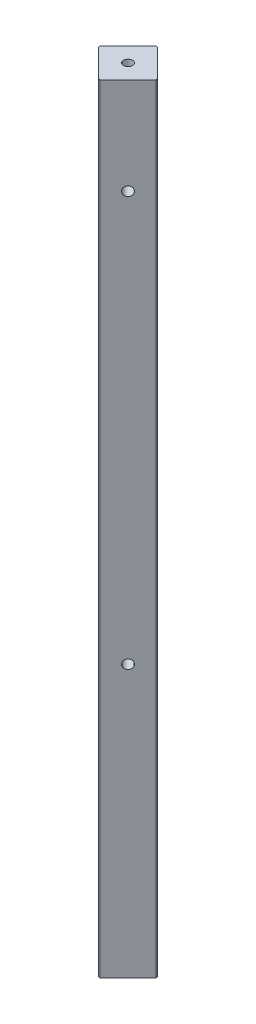
ISO-10303-21;
HEADER;
FILE_DESCRIPTION(('STEP AP214'),'2;1');
FILE_NAME('part.step','',(''),(''),'','','');
FILE_SCHEMA(('AUTOMOTIVE_DESIGN { 1 0 10303 214 1 1 1 1 }'));
ENDSEC;
DATA;
#1=APPLICATION_CONTEXT('core data for automotive mechanical design processes');
#2=APPLICATION_PROTOCOL_DEFINITION('international standard','automotive_design',2000,#1);
#3=PRODUCT_CONTEXT('',#1,'mechanical');
#4=PRODUCT('Part','Part','',(#3));
#5=PRODUCT_RELATED_PRODUCT_CATEGORY('part','',(#4));
#6=PRODUCT_DEFINITION_FORMATION('','',#4);
#7=PRODUCT_DEFINITION_CONTEXT('part definition',#1,'design');
#8=PRODUCT_DEFINITION('design','',#6,#7);
#9=PRODUCT_DEFINITION_SHAPE('','',#8);
#10=(LENGTH_UNIT() NAMED_UNIT(*) SI_UNIT(.MILLI.,.METRE.));
#11=(NAMED_UNIT(*) PLANE_ANGLE_UNIT() SI_UNIT($,.RADIAN.));
#12=(NAMED_UNIT(*) SI_UNIT($,.STERADIAN.) SOLID_ANGLE_UNIT());
#13=UNCERTAINTY_MEASURE_WITH_UNIT(LENGTH_MEASURE(1.E-05),#10,'distance_accuracy_value','');
#14=(GEOMETRIC_REPRESENTATION_CONTEXT(3) GLOBAL_UNCERTAINTY_ASSIGNED_CONTEXT((#13)) GLOBAL_UNIT_ASSIGNED_CONTEXT((#10,
#11,#12)) REPRESENTATION_CONTEXT('',''));
#15=CARTESIAN_POINT('',(0.,0.,0.));
#16=DIRECTION('',(0.,0.,1.));
#17=DIRECTION('',(1.,0.,0.));
#18=AXIS2_PLACEMENT_3D('',#15,#16,#17);
#19=CARTESIAN_POINT('',(9.89949493661166,0.,0.));
#20=DIRECTION('',(0.,-1.,0.));
#21=DIRECTION('',(0.,0.,-1.));
#22=AXIS2_PLACEMENT_3D('',#19,#20,#21);
#23=PLANE('',#22);
#24=CARTESIAN_POINT('',(0.,0.,0.));
#25=DIRECTION('',(0.,-1.,0.));
#26=DIRECTION('',(0.,0.,-1.));
#27=AXIS2_PLACEMENT_3D('',#24,#25,#26);
#28=CIRCLE('',#27,1.64999999999999);
#29=CARTESIAN_POINT('',(0.,0.,-1.64999999999999));
#30=VERTEX_POINT('',#29);
#31=EDGE_CURVE('E116',#30,#30,#28,.T.);
#32=ORIENTED_EDGE('',*,*,#31,.F.);
#33=EDGE_LOOP('',(#32));
#34=FACE_BOUND('',#33,.T.);
#35=CARTESIAN_POINT('',(9.89949493661166,0.,0.));
#36=DIRECTION('',(0.,1.,0.));
#37=DIRECTION('',(0.,0.,-1.));
#38=AXIS2_PLACEMENT_3D('',#35,#36,#37);
#39=CIRCLE('',#38,0.500000000000001);
#40=CARTESIAN_POINT('',(10.2530483272049,0.,0.353553390593277));
#41=VERTEX_POINT('',#40);
#42=CARTESIAN_POINT('',(10.2530483272049,0.,-0.353553390593272));
#43=VERTEX_POINT('',#42);
#44=EDGE_CURVE('E128',#41,#43,#39,.T.);
#45=ORIENTED_EDGE('',*,*,#44,.F.);
#46=DIRECTION('',(0.707106781186548,0.,-0.707106781186547));
#47=VECTOR('',#46,1.);
#48=CARTESIAN_POINT('',(10.2530483272049,0.,0.353553390593277));
#49=LINE('',#48,#47);
#50=CARTESIAN_POINT('',(0.353553390593274,0.,10.2530483272049));
#51=VERTEX_POINT('',#50);
#52=EDGE_CURVE('E164',#51,#41,#49,.T.);
#53=ORIENTED_EDGE('',*,*,#52,.F.);
#54=CARTESIAN_POINT('',(0.,0.,9.89949493661167));
#55=DIRECTION('',(0.,1.,0.));
#56=DIRECTION('',(0.,0.,1.));
#57=AXIS2_PLACEMENT_3D('',#54,#55,#56);
#58=CIRCLE('',#57,0.5);
#59=CARTESIAN_POINT('',(-0.353553390593274,0.,10.2530483272049));
#60=VERTEX_POINT('',#59);
#61=EDGE_CURVE('E161',#60,#51,#58,.T.);
#62=ORIENTED_EDGE('',*,*,#61,.F.);
#63=DIRECTION('',(0.707106781186548,0.,0.707106781186547));
#64=VECTOR('',#63,1.);
#65=CARTESIAN_POINT('',(-10.2530483272049,0.,0.353553390593276));
#66=LINE('',#65,#64);
#67=CARTESIAN_POINT('',(-10.2530483272049,0.,0.353553390593277));
#68=VERTEX_POINT('',#67);
#69=EDGE_CURVE('E158',#68,#60,#66,.T.);
#70=ORIENTED_EDGE('',*,*,#69,.F.);
#71=CARTESIAN_POINT('',(-9.89949493661167,0.,0.));
#72=DIRECTION('',(0.,1.,0.));
#73=DIRECTION('',(0.,0.,1.));
#74=AXIS2_PLACEMENT_3D('',#71,#72,#73);
#75=CIRCLE('',#74,0.500000000000002);
#76=CARTESIAN_POINT('',(-10.2530483272049,0.,-0.353553390593274));
#77=VERTEX_POINT('',#76);
#78=EDGE_CURVE('E155',#77,#68,#75,.T.);
#79=ORIENTED_EDGE('',*,*,#78,.F.);
#80=DIRECTION('',(-0.707106781186548,0.,0.707106781186547));
#81=VECTOR('',#80,1.);
#82=CARTESIAN_POINT('',(-0.353553390593273,0.,-10.2530483272049));
#83=LINE('',#82,#81);
#84=CARTESIAN_POINT('',(-0.353553390593273,0.,-10.2530483272049));
#85=VERTEX_POINT('',#84);
#86=EDGE_CURVE('E152',#85,#77,#83,.T.);
#87=ORIENTED_EDGE('',*,*,#86,.F.);
#88=CARTESIAN_POINT('',(0.,0.,-9.89949493661167));
#89=DIRECTION('',(0.,1.,0.));
#90=DIRECTION('',(0.,0.,1.));
#91=AXIS2_PLACEMENT_3D('',#88,#89,#90);
#92=CIRCLE('',#91,0.5);
#93=CARTESIAN_POINT('',(0.353553390593274,0.,-10.2530483272049));
#94=VERTEX_POINT('',#93);
#95=EDGE_CURVE('E149',#94,#85,#92,.T.);
#96=ORIENTED_EDGE('',*,*,#95,.F.);
#97=DIRECTION('',(-0.707106781186547,0.,-0.707106781186548));
#98=VECTOR('',#97,1.);
#99=CARTESIAN_POINT('',(0.353553390593274,0.,-10.2530483272049));
#100=LINE('',#99,#98);
#101=EDGE_CURVE('E146',#43,#94,#100,.T.);
#102=ORIENTED_EDGE('',*,*,#101,.F.);
#103=EDGE_LOOP('',(#45,#53,#62,#70,#79,#87,#96,#102));
#104=FACE_BOUND('',#103,.T.);
#105=ADVANCED_FACE('F37',(#34,#104),#23,.T.);
#106=CARTESIAN_POINT('',(10.2530483272049,311.414213562373,0.353553390593277));
#107=DIRECTION('',(-0.707106781186547,0.,-0.707106781186548));
#108=DIRECTION('',(-0.707106781186548,0.,0.707106781186547));
#109=AXIS2_PLACEMENT_3D('',#106,#107,#108);
#110=PLANE('',#109);
#111=CARTESIAN_POINT('',(5.30330085890624,98.4999999999996,5.30330085889197));
#112=DIRECTION('',(-0.707106781186547,0.,-0.707106781186548));
#113=DIRECTION('',(-0.707106781186548,0.,0.707106781186547));
#114=AXIS2_PLACEMENT_3D('',#111,#112,#113);
#115=CIRCLE('',#114,1.64999999999999);
#116=CARTESIAN_POINT('',(4.13657466994844,98.4999999999996,6.47002704784977));
#117=VERTEX_POINT('',#116);
#118=EDGE_CURVE('E272',#117,#117,#115,.T.);
#119=ORIENTED_EDGE('',*,*,#118,.T.);
#120=EDGE_LOOP('',(#119));
#121=FACE_BOUND('',#120,.T.);
#122=CARTESIAN_POINT('',(5.30330085890627,247.,5.30330085889194));
#123=DIRECTION('',(-0.707106781186547,0.,-0.707106781186548));
#124=DIRECTION('',(-0.707106781186548,0.,0.707106781186547));
#125=AXIS2_PLACEMENT_3D('',#122,#123,#124);
#126=CIRCLE('',#125,1.64999999999998);
#127=CARTESIAN_POINT('',(4.13657466994848,247.,6.47002704784973));
#128=VERTEX_POINT('',#127);
#129=EDGE_CURVE('E266',#128,#128,#126,.T.);
#130=ORIENTED_EDGE('',*,*,#129,.T.);
#131=EDGE_LOOP('',(#130));
#132=FACE_BOUND('',#131,.T.);
#133=DIRECTION('',(0.,-1.,0.));
#134=VECTOR('',#133,1.);
#135=CARTESIAN_POINT('',(10.2530483272049,311.414213562373,0.353553390593277));
#136=LINE('',#135,#134);
#137=CARTESIAN_POINT('',(10.2530483272049,282.,0.353553390593277));
#138=VERTEX_POINT('',#137);
#139=EDGE_CURVE('E167',#138,#41,#136,.T.);
#140=ORIENTED_EDGE('',*,*,#139,.F.);
#141=DIRECTION('',(-0.707106781186548,0.,0.707106781186547));
#142=VECTOR('',#141,1.);
#143=CARTESIAN_POINT('',(10.2530483272049,282.,0.353553390593277));
#144=LINE('',#143,#142);
#145=CARTESIAN_POINT('',(0.353553390593274,282.,10.2530483272049));
#146=VERTEX_POINT('',#145);
#147=EDGE_CURVE('E133',#138,#146,#144,.T.);
#148=ORIENTED_EDGE('',*,*,#147,.T.);
#149=DIRECTION('',(0.,-1.,0.));
#150=VECTOR('',#149,1.);
#151=CARTESIAN_POINT('',(0.353553390593274,311.414213562373,10.2530483272049));
#152=LINE('',#151,#150);
#153=EDGE_CURVE('E169',#146,#51,#152,.T.);
#154=ORIENTED_EDGE('',*,*,#153,.T.);
#155=ORIENTED_EDGE('',*,*,#52,.T.);
#156=EDGE_LOOP('',(#140,#148,#154,#155));
#157=FACE_BOUND('',#156,.T.);
#158=ADVANCED_FACE('F185',(#121,#132,#157),#110,.F.);
#159=CARTESIAN_POINT('',(0.,311.414213562373,9.89949493661167));
#160=DIRECTION('',(0.,-1.,0.));
#161=DIRECTION('',(0.,0.,-1.));
#162=AXIS2_PLACEMENT_3D('',#159,#160,#161);
#163=CYLINDRICAL_SURFACE('',#162,0.5);
#164=ORIENTED_EDGE('',*,*,#153,.F.);
#165=CARTESIAN_POINT('',(0.,282.,9.89949493661167));
#166=DIRECTION('',(0.,-1.,0.));
#167=DIRECTION('',(0.,0.,-1.));
#168=AXIS2_PLACEMENT_3D('',#165,#166,#167);
#169=CIRCLE('',#168,0.5);
#170=CARTESIAN_POINT('',(-0.353553390593274,282.,10.2530483272049));
#171=VERTEX_POINT('',#170);
#172=EDGE_CURVE('E129',#146,#171,#169,.T.);
#173=ORIENTED_EDGE('',*,*,#172,.T.);
#174=DIRECTION('',(0.,-1.,0.));
#175=VECTOR('',#174,1.);
#176=CARTESIAN_POINT('',(-0.353553390593274,311.414213562373,10.2530483272049));
#177=LINE('',#176,#175);
#178=EDGE_CURVE('E171',#171,#60,#177,.T.);
#179=ORIENTED_EDGE('',*,*,#178,.T.);
#180=ORIENTED_EDGE('',*,*,#61,.T.);
#181=EDGE_LOOP('',(#164,#173,#179,#180));
#182=FACE_BOUND('',#181,.T.);
#183=ADVANCED_FACE('F211',(#182),#163,.T.);
#184=CARTESIAN_POINT('',(-10.2530483272049,311.414213562373,0.353553390593276));
#185=DIRECTION('',(0.707106781186547,0.,-0.707106781186548));
#186=DIRECTION('',(-0.707106781186548,0.,-0.707106781186547));
#187=AXIS2_PLACEMENT_3D('',#184,#185,#186);
#188=PLANE('',#187);
#189=CARTESIAN_POINT('',(-5.30330085889892,268.599999999996,5.3033008588993));
#190=DIRECTION('',(0.707106781186547,0.,-0.707106781186548));
#191=DIRECTION('',(-0.707106781186548,0.,-0.707106781186547));
#192=AXIS2_PLACEMENT_3D('',#189,#190,#191);
#193=CIRCLE('',#192,1.64999999999998);
#194=CARTESIAN_POINT('',(-6.47002704785671,268.599999999996,4.13657466994151));
#195=VERTEX_POINT('',#194);
#196=EDGE_CURVE('E282',#195,#195,#193,.T.);
#197=ORIENTED_EDGE('',*,*,#196,.T.);
#198=EDGE_LOOP('',(#197));
#199=FACE_BOUND('',#198,.T.);
#200=CARTESIAN_POINT('',(-5.30330085889681,252.599999999996,5.3033008589014));
#201=DIRECTION('',(0.707106781186547,0.,-0.707106781186548));
#202=DIRECTION('',(-0.707106781186548,0.,-0.707106781186547));
#203=AXIS2_PLACEMENT_3D('',#200,#201,#202);
#204=CIRCLE('',#203,1.64999999999998);
#205=CARTESIAN_POINT('',(-6.4700270478546,252.599999999996,4.13657466994361));
#206=VERTEX_POINT('',#205);
#207=EDGE_CURVE('E278',#206,#206,#204,.T.);
#208=ORIENTED_EDGE('',*,*,#207,.T.);
#209=EDGE_LOOP('',(#208));
#210=FACE_BOUND('',#209,.T.);
#211=CARTESIAN_POINT('',(-5.30330085889901,90.9999999999999,5.30330085889921));
#212=DIRECTION('',(-0.707106781186547,0.,0.707106781186548));
#213=DIRECTION('',(0.707106781186548,0.,0.707106781186547));
#214=AXIS2_PLACEMENT_3D('',#211,#212,#213);
#215=CIRCLE('',#214,1.64999999999998);
#216=CARTESIAN_POINT('',(-4.13657466994122,90.9999999999999,6.470027047857));
#217=VERTEX_POINT('',#216);
#218=EDGE_CURVE('E261',#217,#217,#215,.T.);
#219=ORIENTED_EDGE('',*,*,#218,.F.);
#220=EDGE_LOOP('',(#219));
#221=FACE_BOUND('',#220,.T.);
#222=CARTESIAN_POINT('',(-5.303300858899,32.0000000000002,5.30330085889921));
#223=DIRECTION('',(-0.707106781186547,0.,0.707106781186548));
#224=DIRECTION('',(0.707106781186548,0.,0.707106781186547));
#225=AXIS2_PLACEMENT_3D('',#222,#223,#224);
#226=CIRCLE('',#225,1.64999999999998);
#227=CARTESIAN_POINT('',(-4.13657466994121,32.0000000000002,6.470027047857));
#228=VERTEX_POINT('',#227);
#229=EDGE_CURVE('E257',#228,#228,#226,.T.);
#230=ORIENTED_EDGE('',*,*,#229,.F.);
#231=EDGE_LOOP('',(#230));
#232=FACE_BOUND('',#231,.T.);
#233=ORIENTED_EDGE('',*,*,#178,.F.);
#234=DIRECTION('',(-0.707106781186548,0.,-0.707106781186547));
#235=VECTOR('',#234,1.);
#236=CARTESIAN_POINT('',(-10.2530483272049,282.,0.353553390593276));
#237=LINE('',#236,#235);
#238=CARTESIAN_POINT('',(-10.2530483272049,282.,0.353553390593277));
#239=VERTEX_POINT('',#238);
#240=EDGE_CURVE('E132',#171,#239,#237,.T.);
#241=ORIENTED_EDGE('',*,*,#240,.T.);
#242=DIRECTION('',(0.,-1.,0.));
#243=VECTOR('',#242,1.);
#244=CARTESIAN_POINT('',(-10.2530483272049,311.414213562373,0.353553390593277));
#245=LINE('',#244,#243);
#246=EDGE_CURVE('E173',#239,#68,#245,.T.);
#247=ORIENTED_EDGE('',*,*,#246,.T.);
#248=ORIENTED_EDGE('',*,*,#69,.T.);
#249=EDGE_LOOP('',(#233,#241,#247,#248));
#250=FACE_BOUND('',#249,.T.);
#251=ADVANCED_FACE('F208',(#199,#210,#221,#232,#250),#188,.F.);
#252=CARTESIAN_POINT('',(-9.89949493661167,311.414213562373,0.));
#253=DIRECTION('',(0.,-1.,0.));
#254=DIRECTION('',(0.,0.,-1.));
#255=AXIS2_PLACEMENT_3D('',#252,#253,#254);
#256=CYLINDRICAL_SURFACE('',#255,0.500000000000002);
#257=ORIENTED_EDGE('',*,*,#246,.F.);
#258=CARTESIAN_POINT('',(-9.89949493661167,282.,0.));
#259=DIRECTION('',(0.,-1.,0.));
#260=DIRECTION('',(0.,0.,-1.));
#261=AXIS2_PLACEMENT_3D('',#258,#259,#260);
#262=CIRCLE('',#261,0.500000000000002);
#263=CARTESIAN_POINT('',(-10.2530483272049,282.,-0.353553390593273));
#264=VERTEX_POINT('',#263);
#265=EDGE_CURVE('E136',#239,#264,#262,.T.);
#266=ORIENTED_EDGE('',*,*,#265,.T.);
#267=DIRECTION('',(0.,-1.,0.));
#268=VECTOR('',#267,1.);
#269=CARTESIAN_POINT('',(-10.2530483272049,311.414213562373,-0.353553390593274));
#270=LINE('',#269,#268);
#271=EDGE_CURVE('E175',#264,#77,#270,.T.);
#272=ORIENTED_EDGE('',*,*,#271,.T.);
#273=ORIENTED_EDGE('',*,*,#78,.T.);
#274=EDGE_LOOP('',(#257,#266,#272,#273));
#275=FACE_BOUND('',#274,.T.);
#276=ADVANCED_FACE('F204',(#275),#256,.T.);
#277=CARTESIAN_POINT('',(-0.353553390593273,311.414213562373,-10.2530483272049));
#278=DIRECTION('',(0.707106781186547,0.,0.707106781186548));
#279=DIRECTION('',(0.707106781186548,0.,-0.707106781186547));
#280=AXIS2_PLACEMENT_3D('',#277,#278,#279);
#281=PLANE('',#280);
#282=CARTESIAN_POINT('',(-5.30330085889197,98.4999999999996,-5.30330085890625));
#283=DIRECTION('',(-0.707106781186547,0.,-0.707106781186548));
#284=DIRECTION('',(-0.707106781186548,0.,0.707106781186547));
#285=AXIS2_PLACEMENT_3D('',#282,#283,#284);
#286=CIRCLE('',#285,1.64999999999998);
#287=CARTESIAN_POINT('',(-6.47002704784977,98.4999999999996,-4.13657466994845));
#288=VERTEX_POINT('',#287);
#289=EDGE_CURVE('E275',#288,#288,#286,.T.);
#290=ORIENTED_EDGE('',*,*,#289,.F.);
#291=EDGE_LOOP('',(#290));
#292=FACE_BOUND('',#291,.T.);
#293=CARTESIAN_POINT('',(-5.30330085889195,247.,-5.30330085890628));
#294=DIRECTION('',(-0.707106781186547,0.,-0.707106781186548));
#295=DIRECTION('',(-0.707106781186548,0.,0.707106781186547));
#296=AXIS2_PLACEMENT_3D('',#293,#294,#295);
#297=CIRCLE('',#296,1.64999999999998);
#298=CARTESIAN_POINT('',(-6.47002704784974,247.,-4.13657466994848));
#299=VERTEX_POINT('',#298);
#300=EDGE_CURVE('E269',#299,#299,#297,.T.);
#301=ORIENTED_EDGE('',*,*,#300,.F.);
#302=EDGE_LOOP('',(#301));
#303=FACE_BOUND('',#302,.T.);
#304=ORIENTED_EDGE('',*,*,#271,.F.);
#305=DIRECTION('',(0.707106781186548,0.,-0.707106781186547));
#306=VECTOR('',#305,1.);
#307=CARTESIAN_POINT('',(-0.353553390593273,282.,-10.2530483272049));
#308=LINE('',#307,#306);
#309=CARTESIAN_POINT('',(-0.353553390593273,282.,-10.2530483272049));
#310=VERTEX_POINT('',#309);
#311=EDGE_CURVE('E139',#264,#310,#308,.T.);
#312=ORIENTED_EDGE('',*,*,#311,.T.);
#313=DIRECTION('',(0.,-1.,0.));
#314=VECTOR('',#313,1.);
#315=CARTESIAN_POINT('',(-0.353553390593273,311.414213562373,-10.2530483272049));
#316=LINE('',#315,#314);
#317=EDGE_CURVE('E177',#310,#85,#316,.T.);
#318=ORIENTED_EDGE('',*,*,#317,.T.);
#319=ORIENTED_EDGE('',*,*,#86,.T.);
#320=EDGE_LOOP('',(#304,#312,#318,#319));
#321=FACE_BOUND('',#320,.T.);
#322=ADVANCED_FACE('F200',(#292,#303,#321),#281,.F.);
#323=CARTESIAN_POINT('',(0.,311.414213562373,-9.89949493661167));
#324=DIRECTION('',(0.,-1.,0.));
#325=DIRECTION('',(0.,0.,-1.));
#326=AXIS2_PLACEMENT_3D('',#323,#324,#325);
#327=CYLINDRICAL_SURFACE('',#326,0.5);
#328=ORIENTED_EDGE('',*,*,#317,.F.);
#329=CARTESIAN_POINT('',(0.,282.,-9.89949493661167));
#330=DIRECTION('',(0.,-1.,0.));
#331=DIRECTION('',(0.,0.,-1.));
#332=AXIS2_PLACEMENT_3D('',#329,#330,#331);
#333=CIRCLE('',#332,0.5);
#334=CARTESIAN_POINT('',(0.353553390593274,282.,-10.2530483272049));
#335=VERTEX_POINT('',#334);
#336=EDGE_CURVE('E58',#310,#335,#333,.T.);
#337=ORIENTED_EDGE('',*,*,#336,.T.);
#338=DIRECTION('',(0.,-1.,0.));
#339=VECTOR('',#338,1.);
#340=CARTESIAN_POINT('',(0.353553390593274,311.414213562373,-10.2530483272049));
#341=LINE('',#340,#339);
#342=EDGE_CURVE('E179',#335,#94,#341,.T.);
#343=ORIENTED_EDGE('',*,*,#342,.T.);
#344=ORIENTED_EDGE('',*,*,#95,.T.);
#345=EDGE_LOOP('',(#328,#337,#343,#344));
#346=FACE_BOUND('',#345,.T.);
#347=ADVANCED_FACE('F196',(#346),#327,.T.);
#348=CARTESIAN_POINT('',(0.353553390593274,311.414213562373,-10.2530483272049));
#349=DIRECTION('',(-0.707106781186548,0.,0.707106781186547));
#350=DIRECTION('',(0.707106781186547,0.,0.707106781186548));
#351=AXIS2_PLACEMENT_3D('',#348,#349,#350);
#352=PLANE('',#351);
#353=CARTESIAN_POINT('',(5.3033008588993,268.599999999996,-5.30330085889891));
#354=DIRECTION('',(0.707106781186548,0.,-0.707106781186547));
#355=DIRECTION('',(-0.707106781186547,0.,-0.707106781186548));
#356=AXIS2_PLACEMENT_3D('',#353,#354,#355);
#357=CIRCLE('',#356,1.64999999999998);
#358=CARTESIAN_POINT('',(4.13657466994151,268.599999999996,-6.47002704785671));
#359=VERTEX_POINT('',#358);
#360=EDGE_CURVE('E245',#359,#359,#357,.T.);
#361=ORIENTED_EDGE('',*,*,#360,.F.);
#362=EDGE_LOOP('',(#361));
#363=FACE_BOUND('',#362,.T.);
#364=CARTESIAN_POINT('',(5.3033008589014,252.599999999996,-5.30330085889681));
#365=DIRECTION('',(0.707106781186548,0.,-0.707106781186547));
#366=DIRECTION('',(-0.707106781186547,0.,-0.707106781186548));
#367=AXIS2_PLACEMENT_3D('',#364,#365,#366);
#368=CIRCLE('',#367,1.64999999999998);
#369=CARTESIAN_POINT('',(4.13657466994361,252.599999999996,-6.4700270478546));
#370=VERTEX_POINT('',#369);
#371=EDGE_CURVE('E249',#370,#370,#368,.T.);
#372=ORIENTED_EDGE('',*,*,#371,.F.);
#373=EDGE_LOOP('',(#372));
#374=FACE_BOUND('',#373,.T.);
#375=CARTESIAN_POINT('',(5.3033008588992,90.9999999999999,-5.30330085889901));
#376=DIRECTION('',(-0.707106781186548,0.,0.707106781186547));
#377=DIRECTION('',(0.707106781186547,0.,0.707106781186548));
#378=AXIS2_PLACEMENT_3D('',#375,#376,#377);
#379=CIRCLE('',#378,1.64999999999999);
#380=CARTESIAN_POINT('',(6.470027047857,90.9999999999999,-4.13657466994121));
#381=VERTEX_POINT('',#380);
#382=EDGE_CURVE('E253',#381,#381,#379,.T.);
#383=ORIENTED_EDGE('',*,*,#382,.T.);
#384=EDGE_LOOP('',(#383));
#385=FACE_BOUND('',#384,.T.);
#386=CARTESIAN_POINT('',(5.30330085889921,32.0000000000002,-5.303300858899));
#387=DIRECTION('',(-0.707106781186548,0.,0.707106781186547));
#388=DIRECTION('',(0.707106781186547,0.,0.707106781186548));
#389=AXIS2_PLACEMENT_3D('',#386,#387,#388);
#390=CIRCLE('',#389,1.64999999999999);
#391=CARTESIAN_POINT('',(6.470027047857,32.0000000000002,-4.13657466994121));
#392=VERTEX_POINT('',#391);
#393=EDGE_CURVE('E41',#392,#392,#390,.T.);
#394=ORIENTED_EDGE('',*,*,#393,.T.);
#395=EDGE_LOOP('',(#394));
#396=FACE_BOUND('',#395,.T.);
#397=ORIENTED_EDGE('',*,*,#342,.F.);
#398=DIRECTION('',(0.707106781186547,0.,0.707106781186548));
#399=VECTOR('',#398,1.);
#400=CARTESIAN_POINT('',(0.353553390593274,282.,-10.2530483272049));
#401=LINE('',#400,#399);
#402=CARTESIAN_POINT('',(10.2530483272049,282.,-0.353553390593273));
#403=VERTEX_POINT('',#402);
#404=EDGE_CURVE('E46',#335,#403,#401,.T.);
#405=ORIENTED_EDGE('',*,*,#404,.T.);
#406=DIRECTION('',(0.,-1.,0.));
#407=VECTOR('',#406,1.);
#408=CARTESIAN_POINT('',(10.2530483272049,311.414213562373,-0.353553390593272));
#409=LINE('',#408,#407);
#410=EDGE_CURVE('E181',#403,#43,#409,.T.);
#411=ORIENTED_EDGE('',*,*,#410,.T.);
#412=ORIENTED_EDGE('',*,*,#101,.T.);
#413=EDGE_LOOP('',(#397,#405,#411,#412));
#414=FACE_BOUND('',#413,.T.);
#415=ADVANCED_FACE('F193',(#363,#374,#385,#396,#414),#352,.F.);
#416=CARTESIAN_POINT('',(9.89949493661166,311.414213562373,0.));
#417=DIRECTION('',(0.,-1.,0.));
#418=DIRECTION('',(0.,0.,-1.));
#419=AXIS2_PLACEMENT_3D('',#416,#417,#418);
#420=CYLINDRICAL_SURFACE('',#419,0.500000000000001);
#421=ORIENTED_EDGE('',*,*,#410,.F.);
#422=CARTESIAN_POINT('',(9.89949493661166,282.,0.));
#423=DIRECTION('',(0.,-1.,0.));
#424=DIRECTION('',(0.,0.,-1.));
#425=AXIS2_PLACEMENT_3D('',#422,#423,#424);
#426=CIRCLE('',#425,0.500000000000001);
#427=EDGE_CURVE('E11',#403,#138,#426,.T.);
#428=ORIENTED_EDGE('',*,*,#427,.T.);
#429=ORIENTED_EDGE('',*,*,#139,.T.);
#430=ORIENTED_EDGE('',*,*,#44,.T.);
#431=EDGE_LOOP('',(#421,#428,#429,#430));
#432=FACE_BOUND('',#431,.T.);
#433=ADVANCED_FACE('F39',(#432),#420,.T.);
#434=CARTESIAN_POINT('',(-11.975235166967,282.,28.6313665508312));
#435=DIRECTION('',(0.,-1.,0.));
#436=DIRECTION('',(-0.707106781186552,0.,-0.707106781186543));
#437=AXIS2_PLACEMENT_3D('',#434,#435,#436);
#438=PLANE('',#437);
#439=CARTESIAN_POINT('',(0.,282.,0.));
#440=DIRECTION('',(0.,1.,0.));
#441=DIRECTION('',(0.,0.,1.));
#442=AXIS2_PLACEMENT_3D('',#439,#440,#441);
#443=CIRCLE('',#442,1.64999999999999);
#444=CARTESIAN_POINT('',(0.,282.,1.64999999999999));
#445=VERTEX_POINT('',#444);
#446=EDGE_CURVE('E117',#445,#445,#443,.T.);
#447=ORIENTED_EDGE('',*,*,#446,.F.);
#448=EDGE_LOOP('',(#447));
#449=FACE_BOUND('',#448,.T.);
#450=ORIENTED_EDGE('',*,*,#404,.F.);
#451=ORIENTED_EDGE('',*,*,#336,.F.);
#452=ORIENTED_EDGE('',*,*,#311,.F.);
#453=ORIENTED_EDGE('',*,*,#265,.F.);
#454=ORIENTED_EDGE('',*,*,#240,.F.);
#455=ORIENTED_EDGE('',*,*,#172,.F.);
#456=ORIENTED_EDGE('',*,*,#147,.F.);
#457=ORIENTED_EDGE('',*,*,#427,.F.);
#458=EDGE_LOOP('',(#450,#451,#452,#453,#454,#455,#456,#457));
#459=FACE_BOUND('',#458,.T.);
#460=ADVANCED_FACE('F187',(#449,#459),#438,.F.);
#461=CARTESIAN_POINT('',(0.,17.1,0.));
#462=DIRECTION('',(0.,-1.,0.));
#463=DIRECTION('',(0.,0.,-1.));
#464=AXIS2_PLACEMENT_3D('',#461,#462,#463);
#465=CONICAL_SURFACE('',#464,1.65,1.02974425867665);
#466=CARTESIAN_POINT('',(0.,18.0914200213955,0.));
#467=VERTEX_POINT('',#466);
#468=VERTEX_LOOP('',#467);
#469=FACE_BOUND('',#468,.T.);
#470=CARTESIAN_POINT('',(0.,17.1,0.));
#471=DIRECTION('',(0.,-1.,0.));
#472=DIRECTION('',(0.,0.,-1.));
#473=AXIS2_PLACEMENT_3D('',#470,#471,#472);
#474=CIRCLE('',#473,1.65);
#475=CARTESIAN_POINT('',(0.,17.1,-1.65));
#476=VERTEX_POINT('',#475);
#477=EDGE_CURVE('E120',#476,#476,#474,.T.);
#478=ORIENTED_EDGE('',*,*,#477,.T.);
#479=EDGE_LOOP('',(#478));
#480=FACE_BOUND('',#479,.T.);
#481=ADVANCED_FACE('F317',(#469,#480),#465,.F.);
#482=CARTESIAN_POINT('',(0.,0.,0.));
#483=DIRECTION('',(0.,-1.,0.));
#484=DIRECTION('',(0.,0.,-1.));
#485=AXIS2_PLACEMENT_3D('',#482,#483,#484);
#486=CYLINDRICAL_SURFACE('',#485,1.64999999999999);
#487=ORIENTED_EDGE('',*,*,#477,.F.);
#488=EDGE_LOOP('',(#487));
#489=FACE_BOUND('',#488,.T.);
#490=ORIENTED_EDGE('',*,*,#31,.T.);
#491=EDGE_LOOP('',(#490));
#492=FACE_BOUND('',#491,.T.);
#493=ADVANCED_FACE('F110',(#489,#492),#486,.F.);
#494=CARTESIAN_POINT('',(0.,272.9,0.));
#495=DIRECTION('',(0.,1.,0.));
#496=DIRECTION('',(0.,0.,1.));
#497=AXIS2_PLACEMENT_3D('',#494,#495,#496);
#498=CONICAL_SURFACE('',#497,1.65,1.02974425867666);
#499=CARTESIAN_POINT('',(0.,271.908579978604,0.));
#500=VERTEX_POINT('',#499);
#501=VERTEX_LOOP('',#500);
#502=FACE_BOUND('',#501,.T.);
#503=CARTESIAN_POINT('',(0.,272.9,0.));
#504=DIRECTION('',(0.,1.,0.));
#505=DIRECTION('',(0.,0.,1.));
#506=AXIS2_PLACEMENT_3D('',#503,#504,#505);
#507=CIRCLE('',#506,1.65);
#508=CARTESIAN_POINT('',(0.,272.9,1.65));
#509=VERTEX_POINT('',#508);
#510=EDGE_CURVE('E114',#509,#509,#507,.T.);
#511=ORIENTED_EDGE('',*,*,#510,.T.);
#512=EDGE_LOOP('',(#511));
#513=FACE_BOUND('',#512,.T.);
#514=ADVANCED_FACE('F106',(#502,#513),#498,.F.);
#515=CARTESIAN_POINT('',(0.,282.,0.));
#516=DIRECTION('',(0.,1.,0.));
#517=DIRECTION('',(0.,0.,1.));
#518=AXIS2_PLACEMENT_3D('',#515,#516,#517);
#519=CYLINDRICAL_SURFACE('',#518,1.64999999999999);
#520=ORIENTED_EDGE('',*,*,#510,.F.);
#521=EDGE_LOOP('',(#520));
#522=FACE_BOUND('',#521,.T.);
#523=ORIENTED_EDGE('',*,*,#446,.T.);
#524=EDGE_LOOP('',(#523));
#525=FACE_BOUND('',#524,.T.);
#526=ADVANCED_FACE('F109',(#522,#525),#519,.F.);
#527=CARTESIAN_POINT('',(-5.303300858899,32.0000000000002,5.30330085889921));
#528=DIRECTION('',(-0.707106781186547,0.,0.707106781186548));
#529=DIRECTION('',(0.707106781186548,0.,0.707106781186547));
#530=AXIS2_PLACEMENT_3D('',#527,#528,#529);
#531=CYLINDRICAL_SURFACE('',#530,1.64999999999999);
#532=ORIENTED_EDGE('',*,*,#229,.T.);
#533=EDGE_LOOP('',(#532));
#534=FACE_BOUND('',#533,.T.);
#535=ORIENTED_EDGE('',*,*,#393,.F.);
#536=EDGE_LOOP('',(#535));
#537=FACE_BOUND('',#536,.T.);
#538=ADVANCED_FACE('F302',(#534,#537),#531,.F.);
#539=CARTESIAN_POINT('',(-5.30330085889901,90.9999999999999,5.30330085889921));
#540=DIRECTION('',(-0.707106781186547,0.,0.707106781186548));
#541=DIRECTION('',(0.707106781186548,0.,0.707106781186547));
#542=AXIS2_PLACEMENT_3D('',#539,#540,#541);
#543=CYLINDRICAL_SURFACE('',#542,1.64999999999999);
#544=ORIENTED_EDGE('',*,*,#218,.T.);
#545=EDGE_LOOP('',(#544));
#546=FACE_BOUND('',#545,.T.);
#547=ORIENTED_EDGE('',*,*,#382,.F.);
#548=EDGE_LOOP('',(#547));
#549=FACE_BOUND('',#548,.T.);
#550=ADVANCED_FACE('F298',(#546,#549),#543,.F.);
#551=CARTESIAN_POINT('',(-5.30330085889194,247.,-5.30330085890627));
#552=DIRECTION('',(-0.707106781186547,0.,-0.707106781186548));
#553=DIRECTION('',(-0.707106781186548,0.,0.707106781186547));
#554=AXIS2_PLACEMENT_3D('',#551,#552,#553);
#555=CYLINDRICAL_SURFACE('',#554,1.64999999999998);
#556=ORIENTED_EDGE('',*,*,#300,.T.);
#557=EDGE_LOOP('',(#556));
#558=FACE_BOUND('',#557,.T.);
#559=ORIENTED_EDGE('',*,*,#129,.F.);
#560=EDGE_LOOP('',(#559));
#561=FACE_BOUND('',#560,.T.);
#562=ADVANCED_FACE('F301',(#558,#561),#555,.F.);
#563=CARTESIAN_POINT('',(-5.30330085889197,98.4999999999996,-5.30330085890624));
#564=DIRECTION('',(-0.707106781186547,0.,-0.707106781186548));
#565=DIRECTION('',(-0.707106781186548,0.,0.707106781186547));
#566=AXIS2_PLACEMENT_3D('',#563,#564,#565);
#567=CYLINDRICAL_SURFACE('',#566,1.64999999999999);
#568=ORIENTED_EDGE('',*,*,#289,.T.);
#569=EDGE_LOOP('',(#568));
#570=FACE_BOUND('',#569,.T.);
#571=ORIENTED_EDGE('',*,*,#118,.F.);
#572=EDGE_LOOP('',(#571));
#573=FACE_BOUND('',#572,.T.);
#574=ADVANCED_FACE('F308',(#570,#573),#567,.F.);
#575=CARTESIAN_POINT('',(5.3033008589014,252.599999999996,-5.30330085889681));
#576=DIRECTION('',(0.707106781186548,0.,-0.707106781186547));
#577=DIRECTION('',(-0.707106781186547,0.,-0.707106781186548));
#578=AXIS2_PLACEMENT_3D('',#575,#576,#577);
#579=CYLINDRICAL_SURFACE('',#578,1.64999999999998);
#580=ORIENTED_EDGE('',*,*,#371,.T.);
#581=EDGE_LOOP('',(#580));
#582=FACE_BOUND('',#581,.T.);
#583=ORIENTED_EDGE('',*,*,#207,.F.);
#584=EDGE_LOOP('',(#583));
#585=FACE_BOUND('',#584,.T.);
#586=ADVANCED_FACE('F289',(#582,#585),#579,.F.);
#587=CARTESIAN_POINT('',(5.3033008588993,268.599999999996,-5.30330085889891));
#588=DIRECTION('',(0.707106781186548,0.,-0.707106781186547));
#589=DIRECTION('',(-0.707106781186547,0.,-0.707106781186548));
#590=AXIS2_PLACEMENT_3D('',#587,#588,#589);
#591=CYLINDRICAL_SURFACE('',#590,1.64999999999998);
#592=ORIENTED_EDGE('',*,*,#360,.T.);
#593=EDGE_LOOP('',(#592));
#594=FACE_BOUND('',#593,.T.);
#595=ORIENTED_EDGE('',*,*,#196,.F.);
#596=EDGE_LOOP('',(#595));
#597=FACE_BOUND('',#596,.T.);
#598=ADVANCED_FACE('F286',(#594,#597),#591,.F.);
#599=CLOSED_SHELL('',(#105,#158,#183,#251,#276,#322,#347,#415,#433,#460,#481,#493,#514,#526,
#538,#550,#562,#574,#586,#598));
#600=MANIFOLD_SOLID_BREP('B2',#599);
#601=ADVANCED_BREP_SHAPE_REPRESENTATION('',(#18,#600),#14);
#602=SHAPE_DEFINITION_REPRESENTATION(#9,#601);
ENDSEC;
END-ISO-10303-21;
